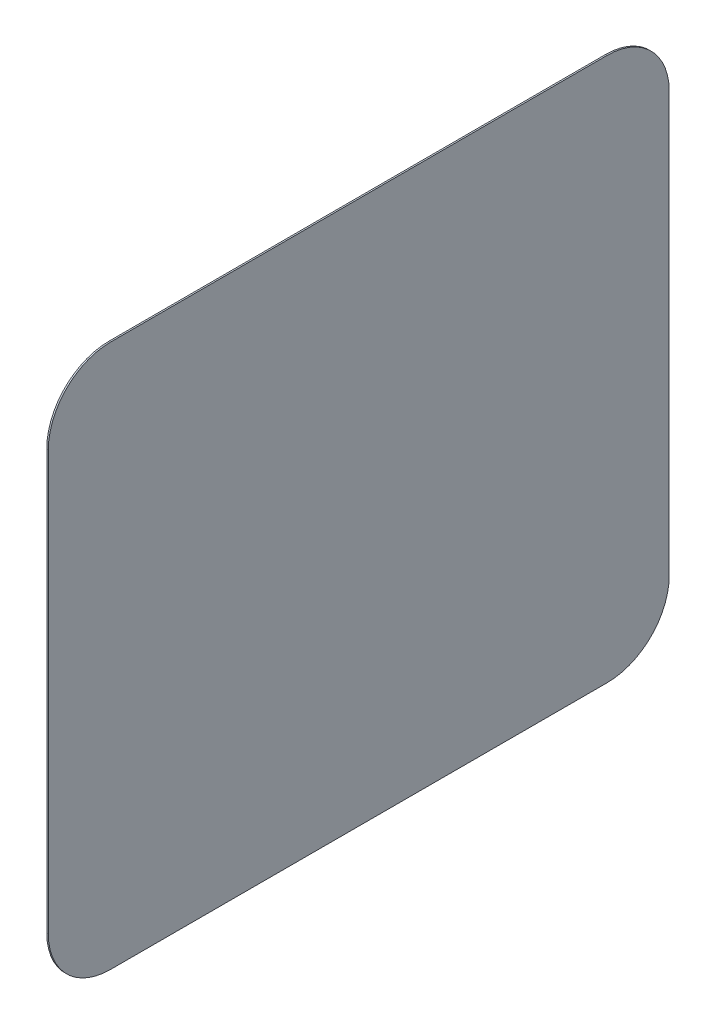
ISO-10303-21;
HEADER;
FILE_DESCRIPTION(('STEP AP214'),'2;1');
FILE_NAME('part.step','',(''),(''),'','','');
FILE_SCHEMA(('AUTOMOTIVE_DESIGN { 1 0 10303 214 1 1 1 1 }'));
ENDSEC;
DATA;
#1=APPLICATION_CONTEXT('core data for automotive mechanical design processes');
#2=APPLICATION_PROTOCOL_DEFINITION('international standard','automotive_design',2000,#1);
#3=PRODUCT_CONTEXT('',#1,'mechanical');
#4=PRODUCT('Part','Part','',(#3));
#5=PRODUCT_RELATED_PRODUCT_CATEGORY('part','',(#4));
#6=PRODUCT_DEFINITION_FORMATION('','',#4);
#7=PRODUCT_DEFINITION_CONTEXT('part definition',#1,'design');
#8=PRODUCT_DEFINITION('design','',#6,#7);
#9=PRODUCT_DEFINITION_SHAPE('','',#8);
#10=(LENGTH_UNIT() NAMED_UNIT(*) SI_UNIT(.MILLI.,.METRE.));
#11=(NAMED_UNIT(*) PLANE_ANGLE_UNIT() SI_UNIT($,.RADIAN.));
#12=(NAMED_UNIT(*) SI_UNIT($,.STERADIAN.) SOLID_ANGLE_UNIT());
#13=UNCERTAINTY_MEASURE_WITH_UNIT(LENGTH_MEASURE(1.E-05),#10,'distance_accuracy_value','');
#14=(GEOMETRIC_REPRESENTATION_CONTEXT(3) GLOBAL_UNCERTAINTY_ASSIGNED_CONTEXT((#13)) GLOBAL_UNIT_ASSIGNED_CONTEXT((#10,
#11,#12)) REPRESENTATION_CONTEXT('',''));
#15=CARTESIAN_POINT('',(0.,0.,0.));
#16=DIRECTION('',(0.,0.,1.));
#17=DIRECTION('',(1.,0.,0.));
#18=AXIS2_PLACEMENT_3D('',#15,#16,#17);
#19=CARTESIAN_POINT('',(22.6000099997661,50.0000000000261,-497.829094128241));
#20=DIRECTION('',(-1.,-3.56745438819933E-13,3.81916720471054E-13));
#21=DIRECTION('',(3.56745438819933E-13,-1.,0.));
#22=AXIS2_PLACEMENT_3D('',#19,#20,#21);
#23=CYLINDRICAL_SURFACE('',#22,4.);
#24=CARTESIAN_POINT('',(22.5000099997661,50.000000000026,-497.829094128241));
#25=DIRECTION('',(-1.,-3.56745438819933E-13,3.81916720471054E-13));
#26=DIRECTION('',(-3.56745438819933E-13,1.,0.));
#27=AXIS2_PLACEMENT_3D('',#24,#25,#26);
#28=CIRCLE('',#27,4.);
#29=CARTESIAN_POINT('',(22.5000099997645,54.000000000026,-497.829094128241));
#30=VERTEX_POINT('',#29);
#31=CARTESIAN_POINT('',(22.5000099997645,50.000000000026,-501.829094128241));
#32=VERTEX_POINT('',#31);
#33=EDGE_CURVE('E129',#30,#32,#28,.T.);
#34=ORIENTED_EDGE('',*,*,#33,.F.);
#35=DIRECTION('',(-1.,-3.56745438819933E-13,3.81916720471054E-13));
#36=VECTOR('',#35,1.);
#37=CARTESIAN_POINT('',(22.6000099997645,54.0000000000261,-497.829094128241));
#38=LINE('',#37,#36);
#39=CARTESIAN_POINT('',(22.6000099997645,54.0000000000261,-497.829094128241));
#40=VERTEX_POINT('',#39);
#41=EDGE_CURVE('E128',#40,#30,#38,.T.);
#42=ORIENTED_EDGE('',*,*,#41,.F.);
#43=CARTESIAN_POINT('',(22.6000099997661,50.0000000000261,-497.829094128241));
#44=DIRECTION('',(-1.,-3.56745438819933E-13,3.81916720471054E-13));
#45=DIRECTION('',(-3.56745438819933E-13,1.,0.));
#46=AXIS2_PLACEMENT_3D('',#43,#44,#45);
#47=CIRCLE('',#46,4.);
#48=CARTESIAN_POINT('',(22.6000099997645,50.000000000026,-501.829094128241));
#49=VERTEX_POINT('',#48);
#50=EDGE_CURVE('E147',#40,#49,#47,.T.);
#51=ORIENTED_EDGE('',*,*,#50,.T.);
#52=DIRECTION('',(-1.,-3.56745438819933E-13,3.81916720471054E-13));
#53=VECTOR('',#52,1.);
#54=CARTESIAN_POINT('',(22.6000099997645,50.000000000026,-501.829094128241));
#55=LINE('',#54,#53);
#56=EDGE_CURVE('E11',#49,#32,#55,.T.);
#57=ORIENTED_EDGE('',*,*,#56,.T.);
#58=EDGE_LOOP('',(#34,#42,#51,#57));
#59=FACE_BOUND('',#58,.T.);
#60=ADVANCED_FACE('F33',(#59),#23,.T.);
#61=CARTESIAN_POINT('',(22.6000099997645,50.000000000026,-501.829094128241));
#62=DIRECTION('',(3.81916720471054E-13,0.,1.));
#63=DIRECTION('',(-1.,0.,3.81916720471054E-13));
#64=AXIS2_PLACEMENT_3D('',#61,#62,#63);
#65=PLANE('',#64);
#66=DIRECTION('',(3.56710545874935E-13,-1.,0.));
#67=VECTOR('',#66,1.);
#68=CARTESIAN_POINT('',(22.5000099997645,50.000000000026,-501.829094128241));
#69=LINE('',#68,#67);
#70=CARTESIAN_POINT('',(22.5000099997741,23.0000000000261,-501.829094128241));
#71=VERTEX_POINT('',#70);
#72=EDGE_CURVE('E131',#32,#71,#69,.T.);
#73=ORIENTED_EDGE('',*,*,#72,.F.);
#74=ORIENTED_EDGE('',*,*,#56,.F.);
#75=DIRECTION('',(3.56710545874935E-13,-1.,0.));
#76=VECTOR('',#75,1.);
#77=CARTESIAN_POINT('',(22.6000099997645,50.000000000026,-501.829094128241));
#78=LINE('',#77,#76);
#79=CARTESIAN_POINT('',(22.6000099997741,23.0000000000261,-501.829094128241));
#80=VERTEX_POINT('',#79);
#81=EDGE_CURVE('E87',#49,#80,#78,.T.);
#82=ORIENTED_EDGE('',*,*,#81,.T.);
#83=DIRECTION('',(-1.,-3.56745438819933E-13,3.81916720471054E-13));
#84=VECTOR('',#83,1.);
#85=CARTESIAN_POINT('',(22.6000099997741,23.0000000000261,-501.829094128241));
#86=LINE('',#85,#84);
#87=EDGE_CURVE('E41',#80,#71,#86,.T.);
#88=ORIENTED_EDGE('',*,*,#87,.T.);
#89=EDGE_LOOP('',(#73,#74,#82,#88));
#90=FACE_BOUND('',#89,.T.);
#91=ADVANCED_FACE('F159',(#90),#65,.F.);
#92=CARTESIAN_POINT('',(22.6000099997756,23.0000000000261,-497.829094128241));
#93=DIRECTION('',(-1.,-3.56745438819933E-13,3.81916720471054E-13));
#94=DIRECTION('',(3.56745438819933E-13,-1.,0.));
#95=AXIS2_PLACEMENT_3D('',#92,#93,#94);
#96=CYLINDRICAL_SURFACE('',#95,4.);
#97=CARTESIAN_POINT('',(22.5000099997756,23.000000000026,-497.829094128241));
#98=DIRECTION('',(-1.,-3.56745438819933E-13,3.81916720471054E-13));
#99=DIRECTION('',(3.56745438819933E-13,-1.,0.));
#100=AXIS2_PLACEMENT_3D('',#97,#98,#99);
#101=CIRCLE('',#100,4.);
#102=CARTESIAN_POINT('',(22.5000099997772,19.000000000026,-497.829094128241));
#103=VERTEX_POINT('',#102);
#104=EDGE_CURVE('E134',#71,#103,#101,.T.);
#105=ORIENTED_EDGE('',*,*,#104,.F.);
#106=ORIENTED_EDGE('',*,*,#87,.F.);
#107=CARTESIAN_POINT('',(22.6000099997756,23.0000000000261,-497.829094128241));
#108=DIRECTION('',(-1.,-3.56745438819933E-13,3.81916720471054E-13));
#109=DIRECTION('',(3.56745438819933E-13,-1.,0.));
#110=AXIS2_PLACEMENT_3D('',#107,#108,#109);
#111=CIRCLE('',#110,4.);
#112=CARTESIAN_POINT('',(22.6000099997772,19.0000000000261,-497.829094128241));
#113=VERTEX_POINT('',#112);
#114=EDGE_CURVE('E168',#80,#113,#111,.T.);
#115=ORIENTED_EDGE('',*,*,#114,.T.);
#116=DIRECTION('',(-1.,-3.56745438819933E-13,3.81916720471054E-13));
#117=VECTOR('',#116,1.);
#118=CARTESIAN_POINT('',(22.6000099997772,19.0000000000261,-497.829094128241));
#119=LINE('',#118,#117);
#120=EDGE_CURVE('E154',#113,#103,#119,.T.);
#121=ORIENTED_EDGE('',*,*,#120,.T.);
#122=EDGE_LOOP('',(#105,#106,#115,#121));
#123=FACE_BOUND('',#122,.T.);
#124=ADVANCED_FACE('F178',(#123),#96,.T.);
#125=CARTESIAN_POINT('',(22.6000099997772,19.0000000000261,-497.829094128241));
#126=DIRECTION('',(-3.56745438819933E-13,1.,0.));
#127=DIRECTION('',(-1.,-3.56745438819933E-13,3.81916720471054E-13));
#128=AXIS2_PLACEMENT_3D('',#125,#126,#127);
#129=PLANE('',#128);
#130=DIRECTION('',(3.81916720471054E-13,0.,1.));
#131=VECTOR('',#130,1.);
#132=CARTESIAN_POINT('',(22.5000099997772,19.000000000026,-497.829094128241));
#133=LINE('',#132,#131);
#134=CARTESIAN_POINT('',(22.5000099997892,19.000000000026,-465.831385650792));
#135=VERTEX_POINT('',#134);
#136=EDGE_CURVE('E137',#103,#135,#133,.T.);
#137=ORIENTED_EDGE('',*,*,#136,.F.);
#138=ORIENTED_EDGE('',*,*,#120,.F.);
#139=DIRECTION('',(3.81916720471054E-13,0.,1.));
#140=VECTOR('',#139,1.);
#141=CARTESIAN_POINT('',(22.6000099997772,19.0000000000261,-497.829094128241));
#142=LINE('',#141,#140);
#143=CARTESIAN_POINT('',(22.6000099997892,19.0000000000261,-465.831385650792));
#144=VERTEX_POINT('',#143);
#145=EDGE_CURVE('E123',#113,#144,#142,.T.);
#146=ORIENTED_EDGE('',*,*,#145,.T.);
#147=DIRECTION('',(-1.,-3.56745438819933E-13,3.81916720471054E-13));
#148=VECTOR('',#147,1.);
#149=CARTESIAN_POINT('',(22.6000099997892,19.0000000000261,-465.831385650792));
#150=LINE('',#149,#148);
#151=EDGE_CURVE('E151',#144,#135,#150,.T.);
#152=ORIENTED_EDGE('',*,*,#151,.T.);
#153=EDGE_LOOP('',(#137,#138,#146,#152));
#154=FACE_BOUND('',#153,.T.);
#155=ADVANCED_FACE('F174',(#154),#129,.F.);
#156=CARTESIAN_POINT('',(22.6000099997879,23.0000000000261,-465.831385650792));
#157=DIRECTION('',(-1.,-3.56745438819933E-13,3.81916720471054E-13));
#158=DIRECTION('',(3.56745438819933E-13,-1.,0.));
#159=AXIS2_PLACEMENT_3D('',#156,#157,#158);
#160=CYLINDRICAL_SURFACE('',#159,4.);
#161=CARTESIAN_POINT('',(22.5000099997879,23.000000000026,-465.831385650791));
#162=DIRECTION('',(-1.,-3.56745438819933E-13,3.81916720471054E-13));
#163=DIRECTION('',(-3.56745438819933E-13,1.,0.));
#164=AXIS2_PLACEMENT_3D('',#161,#162,#163);
#165=CIRCLE('',#164,4.);
#166=CARTESIAN_POINT('',(22.5000099997895,23.0000000000261,-461.831385650791));
#167=VERTEX_POINT('',#166);
#168=EDGE_CURVE('E140',#135,#167,#165,.T.);
#169=ORIENTED_EDGE('',*,*,#168,.F.);
#170=ORIENTED_EDGE('',*,*,#151,.F.);
#171=CARTESIAN_POINT('',(22.6000099997879,23.0000000000261,-465.831385650792));
#172=DIRECTION('',(-1.,-3.56745438819933E-13,3.81916720471054E-13));
#173=DIRECTION('',(-3.56745438819933E-13,1.,0.));
#174=AXIS2_PLACEMENT_3D('',#171,#172,#173);
#175=CIRCLE('',#174,4.);
#176=CARTESIAN_POINT('',(22.6000099997894,23.0000000000261,-461.831385650792));
#177=VERTEX_POINT('',#176);
#178=EDGE_CURVE('E121',#144,#177,#175,.T.);
#179=ORIENTED_EDGE('',*,*,#178,.T.);
#180=DIRECTION('',(-1.,-3.56745438819933E-13,3.81916720471054E-13));
#181=VECTOR('',#180,1.);
#182=CARTESIAN_POINT('',(22.6000099997894,23.0000000000261,-461.831385650792));
#183=LINE('',#182,#181);
#184=EDGE_CURVE('E115',#177,#167,#183,.T.);
#185=ORIENTED_EDGE('',*,*,#184,.T.);
#186=EDGE_LOOP('',(#169,#170,#179,#185));
#187=FACE_BOUND('',#186,.T.);
#188=ADVANCED_FACE('F177',(#187),#160,.T.);
#189=CARTESIAN_POINT('',(22.6000099997894,23.0000000000261,-461.831385650792));
#190=DIRECTION('',(-3.81916720471055E-13,0.,-1.));
#191=DIRECTION('',(0.,-1.,0.));
#192=AXIS2_PLACEMENT_3D('',#189,#190,#191);
#193=PLANE('',#192);
#194=DIRECTION('',(-3.56710545874934E-13,1.,0.));
#195=VECTOR('',#194,1.);
#196=CARTESIAN_POINT('',(22.5000099997895,23.0000000000261,-461.831385650791));
#197=LINE('',#196,#195);
#198=CARTESIAN_POINT('',(22.5000099997797,50.000000000026,-461.831385650791));
#199=VERTEX_POINT('',#198);
#200=EDGE_CURVE('E143',#167,#199,#197,.T.);
#201=ORIENTED_EDGE('',*,*,#200,.F.);
#202=ORIENTED_EDGE('',*,*,#184,.F.);
#203=DIRECTION('',(-3.56710545874934E-13,1.,0.));
#204=VECTOR('',#203,1.);
#205=CARTESIAN_POINT('',(22.6000099997894,23.0000000000261,-461.831385650792));
#206=LINE('',#205,#204);
#207=CARTESIAN_POINT('',(22.6000099997797,50.000000000026,-461.831385650791));
#208=VERTEX_POINT('',#207);
#209=EDGE_CURVE('E105',#177,#208,#206,.T.);
#210=ORIENTED_EDGE('',*,*,#209,.T.);
#211=DIRECTION('',(-1.,-3.56745438819933E-13,3.81916720471054E-13));
#212=VECTOR('',#211,1.);
#213=CARTESIAN_POINT('',(22.6000099997797,50.000000000026,-461.831385650791));
#214=LINE('',#213,#212);
#215=EDGE_CURVE('E110',#208,#199,#214,.T.);
#216=ORIENTED_EDGE('',*,*,#215,.T.);
#217=EDGE_LOOP('',(#201,#202,#210,#216));
#218=FACE_BOUND('',#217,.T.);
#219=ADVANCED_FACE('F118',(#218),#193,.F.);
#220=CARTESIAN_POINT('',(22.6000099997783,50.0000000000261,-465.831385650791));
#221=DIRECTION('',(-1.,-3.56745438819933E-13,3.81916720471054E-13));
#222=DIRECTION('',(3.56745438819933E-13,-1.,0.));
#223=AXIS2_PLACEMENT_3D('',#220,#221,#222);
#224=CYLINDRICAL_SURFACE('',#223,4.);
#225=CARTESIAN_POINT('',(22.5000099997781,50.000000000026,-465.831385650791));
#226=DIRECTION('',(-1.,-3.56745438819933E-13,3.81916720471054E-13));
#227=DIRECTION('',(-3.56745438819933E-13,1.,0.));
#228=AXIS2_PLACEMENT_3D('',#225,#226,#227);
#229=CIRCLE('',#228,4.);
#230=CARTESIAN_POINT('',(22.5000099997768,54.000000000026,-465.831385650791));
#231=VERTEX_POINT('',#230);
#232=EDGE_CURVE('E112',#199,#231,#229,.T.);
#233=ORIENTED_EDGE('',*,*,#232,.F.);
#234=ORIENTED_EDGE('',*,*,#215,.F.);
#235=CARTESIAN_POINT('',(22.6000099997783,50.0000000000261,-465.831385650791));
#236=DIRECTION('',(-1.,-3.56745438819933E-13,3.81916720471054E-13));
#237=DIRECTION('',(-3.56745438819933E-13,1.,0.));
#238=AXIS2_PLACEMENT_3D('',#235,#236,#237);
#239=CIRCLE('',#238,4.);
#240=CARTESIAN_POINT('',(22.6000099997768,54.0000000000261,-465.831385650791));
#241=VERTEX_POINT('',#240);
#242=EDGE_CURVE('E101',#208,#241,#239,.T.);
#243=ORIENTED_EDGE('',*,*,#242,.T.);
#244=DIRECTION('',(-1.,-3.56745438819933E-13,3.81916720471054E-13));
#245=VECTOR('',#244,1.);
#246=CARTESIAN_POINT('',(22.6000099997768,54.0000000000261,-465.831385650791));
#247=LINE('',#246,#245);
#248=EDGE_CURVE('E116',#241,#231,#247,.T.);
#249=ORIENTED_EDGE('',*,*,#248,.T.);
#250=EDGE_LOOP('',(#233,#234,#243,#249));
#251=FACE_BOUND('',#250,.T.);
#252=ADVANCED_FACE('F111',(#251),#224,.T.);
#253=CARTESIAN_POINT('',(22.6000099997768,54.0000000000261,-465.831385650792));
#254=DIRECTION('',(3.56745438819932E-13,-1.,0.));
#255=DIRECTION('',(1.,3.56745438819933E-13,-3.81916720471054E-13));
#256=AXIS2_PLACEMENT_3D('',#253,#254,#255);
#257=PLANE('',#256);
#258=DIRECTION('',(-3.81916720471054E-13,0.,-1.));
#259=VECTOR('',#258,1.);
#260=CARTESIAN_POINT('',(22.5000099997768,54.000000000026,-465.831385650791));
#261=LINE('',#260,#259);
#262=EDGE_CURVE('E75',#231,#30,#261,.T.);
#263=ORIENTED_EDGE('',*,*,#262,.F.);
#264=ORIENTED_EDGE('',*,*,#248,.F.);
#265=DIRECTION('',(-3.81916720471054E-13,0.,-1.));
#266=VECTOR('',#265,1.);
#267=CARTESIAN_POINT('',(22.6000099997768,54.0000000000261,-465.831385650792));
#268=LINE('',#267,#266);
#269=EDGE_CURVE('E49',#241,#40,#268,.T.);
#270=ORIENTED_EDGE('',*,*,#269,.T.);
#271=ORIENTED_EDGE('',*,*,#41,.T.);
#272=EDGE_LOOP('',(#263,#264,#270,#271));
#273=FACE_BOUND('',#272,.T.);
#274=ADVANCED_FACE('F230',(#273),#257,.F.);
#275=CARTESIAN_POINT('',(22.6000099997661,50.0000000000261,-497.829094128241));
#276=DIRECTION('',(1.,3.56745438819933E-13,-3.81916720471054E-13));
#277=DIRECTION('',(-3.56745438819933E-13,1.,0.));
#278=AXIS2_PLACEMENT_3D('',#275,#276,#277);
#279=PLANE('',#278);
#280=ORIENTED_EDGE('',*,*,#50,.F.);
#281=ORIENTED_EDGE('',*,*,#269,.F.);
#282=ORIENTED_EDGE('',*,*,#242,.F.);
#283=ORIENTED_EDGE('',*,*,#209,.F.);
#284=ORIENTED_EDGE('',*,*,#178,.F.);
#285=ORIENTED_EDGE('',*,*,#145,.F.);
#286=ORIENTED_EDGE('',*,*,#114,.F.);
#287=ORIENTED_EDGE('',*,*,#81,.F.);
#288=EDGE_LOOP('',(#280,#281,#282,#283,#284,#285,#286,#287));
#289=FACE_BOUND('',#288,.T.);
#290=ADVANCED_FACE('F103',(#289),#279,.T.);
#291=CARTESIAN_POINT('',(22.5000099997661,50.000000000026,-497.829094128241));
#292=DIRECTION('',(1.,3.56745438819933E-13,-3.81916720471054E-13));
#293=DIRECTION('',(-3.56745438819933E-13,1.,0.));
#294=AXIS2_PLACEMENT_3D('',#291,#292,#293);
#295=PLANE('',#294);
#296=ORIENTED_EDGE('',*,*,#33,.T.);
#297=ORIENTED_EDGE('',*,*,#72,.T.);
#298=ORIENTED_EDGE('',*,*,#104,.T.);
#299=ORIENTED_EDGE('',*,*,#136,.T.);
#300=ORIENTED_EDGE('',*,*,#168,.T.);
#301=ORIENTED_EDGE('',*,*,#200,.T.);
#302=ORIENTED_EDGE('',*,*,#232,.T.);
#303=ORIENTED_EDGE('',*,*,#262,.T.);
#304=EDGE_LOOP('',(#296,#297,#298,#299,#300,#301,#302,#303));
#305=FACE_BOUND('',#304,.T.);
#306=ADVANCED_FACE('F162',(#305),#295,.F.);
#307=CLOSED_SHELL('',(#60,#91,#124,#155,#188,#219,#252,#274,#290,#306));
#308=MANIFOLD_SOLID_BREP('B2',#307);
#309=ADVANCED_BREP_SHAPE_REPRESENTATION('',(#18,#308),#14);
#310=SHAPE_DEFINITION_REPRESENTATION(#9,#309);
ENDSEC;
END-ISO-10303-21;
